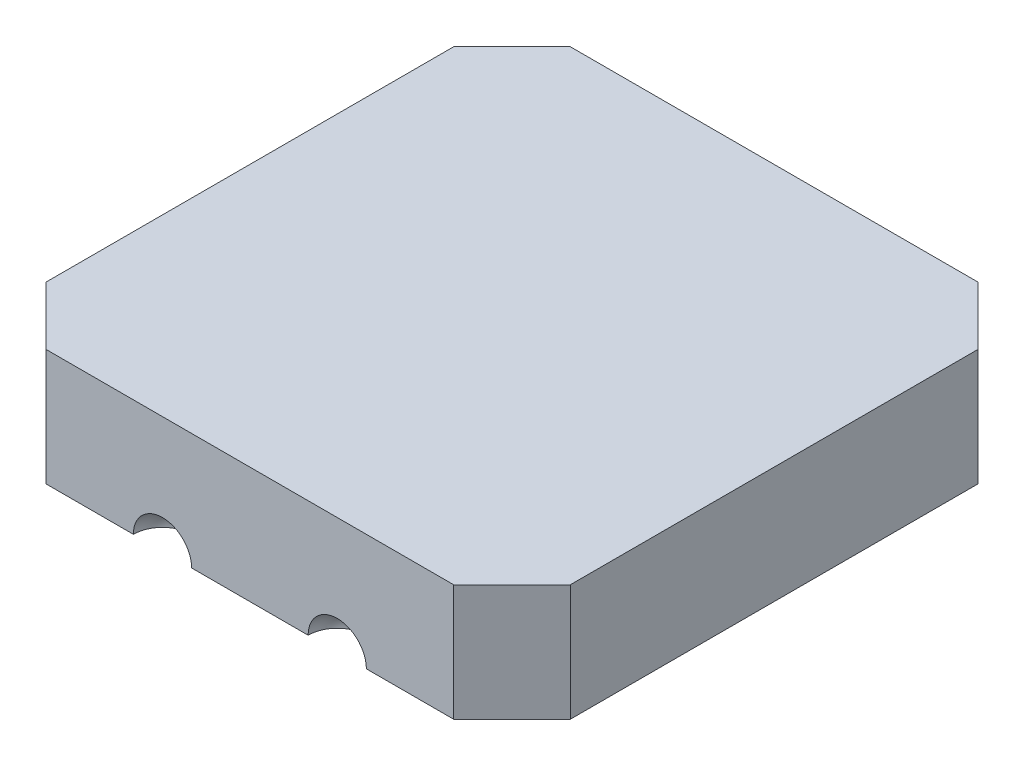
ISO-10303-21;
HEADER;
FILE_DESCRIPTION(('STEP AP214'),'2;1');
FILE_NAME('part.step','',(''),(''),'','','');
FILE_SCHEMA(('AUTOMOTIVE_DESIGN { 1 0 10303 214 1 1 1 1 }'));
ENDSEC;
DATA;
#1=APPLICATION_CONTEXT('core data for automotive mechanical design processes');
#2=APPLICATION_PROTOCOL_DEFINITION('international standard','automotive_design',2000,#1);
#3=PRODUCT_CONTEXT('',#1,'mechanical');
#4=PRODUCT('Part','Part','',(#3));
#5=PRODUCT_RELATED_PRODUCT_CATEGORY('part','',(#4));
#6=PRODUCT_DEFINITION_FORMATION('','',#4);
#7=PRODUCT_DEFINITION_CONTEXT('part definition',#1,'design');
#8=PRODUCT_DEFINITION('design','',#6,#7);
#9=PRODUCT_DEFINITION_SHAPE('','',#8);
#10=(LENGTH_UNIT() NAMED_UNIT(*) SI_UNIT(.MILLI.,.METRE.));
#11=(NAMED_UNIT(*) PLANE_ANGLE_UNIT() SI_UNIT($,.RADIAN.));
#12=(NAMED_UNIT(*) SI_UNIT($,.STERADIAN.) SOLID_ANGLE_UNIT());
#13=UNCERTAINTY_MEASURE_WITH_UNIT(LENGTH_MEASURE(1.E-05),#10,'distance_accuracy_value','');
#14=(GEOMETRIC_REPRESENTATION_CONTEXT(3) GLOBAL_UNCERTAINTY_ASSIGNED_CONTEXT((#13)) GLOBAL_UNIT_ASSIGNED_CONTEXT((#10,
#11,#12)) REPRESENTATION_CONTEXT('',''));
#15=CARTESIAN_POINT('',(0.,0.,0.));
#16=DIRECTION('',(0.,0.,1.));
#17=DIRECTION('',(1.,0.,0.));
#18=AXIS2_PLACEMENT_3D('',#15,#16,#17);
#19=CARTESIAN_POINT('',(57.15,25.4,57.15));
#20=DIRECTION('',(-1.,0.,0.));
#21=DIRECTION('',(0.,0.,1.));
#22=AXIS2_PLACEMENT_3D('',#19,#20,#21);
#23=PLANE('',#22);
#24=DIRECTION('',(0.,0.,-1.));
#25=VECTOR('',#24,1.);
#26=CARTESIAN_POINT('',(57.15,0.,57.15));
#27=LINE('',#26,#25);
#28=CARTESIAN_POINT('',(57.15,0.,44.45));
#29=VERTEX_POINT('',#28);
#30=CARTESIAN_POINT('',(57.15,0.,-44.4499999999999));
#31=VERTEX_POINT('',#30);
#32=EDGE_CURVE('E179',#29,#31,#27,.T.);
#33=ORIENTED_EDGE('',*,*,#32,.T.);
#34=DIRECTION('',(0.,1.,0.));
#35=VECTOR('',#34,1.);
#36=CARTESIAN_POINT('',(57.15,25.4,-44.4499999999999));
#37=LINE('',#36,#35);
#38=CARTESIAN_POINT('',(57.15,25.4,-44.4499999999999));
#39=VERTEX_POINT('',#38);
#40=EDGE_CURVE('E129',#31,#39,#37,.T.);
#41=ORIENTED_EDGE('',*,*,#40,.T.);
#42=DIRECTION('',(0.,0.,-1.));
#43=VECTOR('',#42,1.);
#44=CARTESIAN_POINT('',(57.15,25.4,57.15));
#45=LINE('',#44,#43);
#46=CARTESIAN_POINT('',(57.15,25.4,44.45));
#47=VERTEX_POINT('',#46);
#48=EDGE_CURVE('E153',#47,#39,#45,.T.);
#49=ORIENTED_EDGE('',*,*,#48,.F.);
#50=DIRECTION('',(0.,-1.,0.));
#51=VECTOR('',#50,1.);
#52=CARTESIAN_POINT('',(57.15,25.4,44.45));
#53=LINE('',#52,#51);
#54=EDGE_CURVE('E203',#47,#29,#53,.T.);
#55=ORIENTED_EDGE('',*,*,#54,.T.);
#56=EDGE_LOOP('',(#33,#41,#49,#55));
#57=FACE_BOUND('',#56,.T.);
#58=ADVANCED_FACE('F48',(#57),#23,.F.);
#59=CARTESIAN_POINT('',(-57.15,25.4,-57.15));
#60=DIRECTION('',(0.,0.,1.));
#61=DIRECTION('',(1.,0.,0.));
#62=AXIS2_PLACEMENT_3D('',#59,#60,#61);
#63=PLANE('',#62);
#64=DIRECTION('',(-1.,0.,0.));
#65=VECTOR('',#64,1.);
#66=CARTESIAN_POINT('',(-57.15,0.,-57.15));
#67=LINE('',#66,#65);
#68=CARTESIAN_POINT('',(44.45,0.,-57.15));
#69=VERTEX_POINT('',#68);
#70=CARTESIAN_POINT('',(-44.45,0.,-57.15));
#71=VERTEX_POINT('',#70);
#72=EDGE_CURVE('E148',#69,#71,#67,.T.);
#73=ORIENTED_EDGE('',*,*,#72,.T.);
#74=DIRECTION('',(0.,1.,0.));
#75=VECTOR('',#74,1.);
#76=CARTESIAN_POINT('',(-44.45,25.4,-57.15));
#77=LINE('',#76,#75);
#78=CARTESIAN_POINT('',(-44.45,25.4,-57.15));
#79=VERTEX_POINT('',#78);
#80=EDGE_CURVE('E192',#71,#79,#77,.T.);
#81=ORIENTED_EDGE('',*,*,#80,.T.);
#82=DIRECTION('',(-1.,0.,0.));
#83=VECTOR('',#82,1.);
#84=CARTESIAN_POINT('',(-57.15,25.4,-57.15));
#85=LINE('',#84,#83);
#86=CARTESIAN_POINT('',(44.45,25.4,-57.15));
#87=VERTEX_POINT('',#86);
#88=EDGE_CURVE('E158',#87,#79,#85,.T.);
#89=ORIENTED_EDGE('',*,*,#88,.F.);
#90=DIRECTION('',(0.,-1.,0.));
#91=VECTOR('',#90,1.);
#92=CARTESIAN_POINT('',(44.45,25.4,-57.15));
#93=LINE('',#92,#91);
#94=EDGE_CURVE('E194',#87,#69,#93,.T.);
#95=ORIENTED_EDGE('',*,*,#94,.T.);
#96=EDGE_LOOP('',(#73,#81,#89,#95));
#97=FACE_BOUND('',#96,.T.);
#98=ADVANCED_FACE('F190',(#97),#63,.F.);
#99=CARTESIAN_POINT('',(-57.15,25.4,57.15));
#100=DIRECTION('',(1.,0.,0.));
#101=DIRECTION('',(0.,0.,-1.));
#102=AXIS2_PLACEMENT_3D('',#99,#100,#101);
#103=PLANE('',#102);
#104=DIRECTION('',(0.,0.,1.));
#105=VECTOR('',#104,1.);
#106=CARTESIAN_POINT('',(-57.15,0.,57.15));
#107=LINE('',#106,#105);
#108=CARTESIAN_POINT('',(-57.15,0.,-44.45));
#109=VERTEX_POINT('',#108);
#110=CARTESIAN_POINT('',(-57.15,0.,44.4499999999999));
#111=VERTEX_POINT('',#110);
#112=EDGE_CURVE('E142',#109,#111,#107,.T.);
#113=ORIENTED_EDGE('',*,*,#112,.T.);
#114=DIRECTION('',(0.,1.,0.));
#115=VECTOR('',#114,1.);
#116=CARTESIAN_POINT('',(-57.15,25.4,44.4499999999999));
#117=LINE('',#116,#115);
#118=CARTESIAN_POINT('',(-57.15,25.4,44.4499999999999));
#119=VERTEX_POINT('',#118);
#120=EDGE_CURVE('E227',#111,#119,#117,.T.);
#121=ORIENTED_EDGE('',*,*,#120,.T.);
#122=DIRECTION('',(0.,0.,1.));
#123=VECTOR('',#122,1.);
#124=CARTESIAN_POINT('',(-57.15,25.4,57.15));
#125=LINE('',#124,#123);
#126=CARTESIAN_POINT('',(-57.15,25.4,-44.45));
#127=VERTEX_POINT('',#126);
#128=EDGE_CURVE('E165',#127,#119,#125,.T.);
#129=ORIENTED_EDGE('',*,*,#128,.F.);
#130=DIRECTION('',(0.,-1.,0.));
#131=VECTOR('',#130,1.);
#132=CARTESIAN_POINT('',(-57.15,25.4,-44.45));
#133=LINE('',#132,#131);
#134=EDGE_CURVE('E254',#127,#109,#133,.T.);
#135=ORIENTED_EDGE('',*,*,#134,.T.);
#136=EDGE_LOOP('',(#113,#121,#129,#135));
#137=FACE_BOUND('',#136,.T.);
#138=ADVANCED_FACE('F258',(#137),#103,.F.);
#139=CARTESIAN_POINT('',(-57.15,25.4,57.15));
#140=DIRECTION('',(0.,0.,-1.));
#141=DIRECTION('',(-1.,0.,0.));
#142=AXIS2_PLACEMENT_3D('',#139,#140,#141);
#143=PLANE('',#142);
#144=CARTESIAN_POINT('',(-19.05,0.,57.15));
#145=DIRECTION('',(0.,0.,-1.));
#146=DIRECTION('',(-1.,0.,0.));
#147=AXIS2_PLACEMENT_3D('',#144,#145,#146);
#148=CIRCLE('',#147,6.35);
#149=CARTESIAN_POINT('',(-12.7,0.,57.15));
#150=VERTEX_POINT('',#149);
#151=CARTESIAN_POINT('',(-25.4,0.,57.15));
#152=VERTEX_POINT('',#151);
#153=EDGE_CURVE('E71',#150,#152,#148,.F.);
#154=ORIENTED_EDGE('',*,*,#153,.F.);
#155=DIRECTION('',(1.,0.,0.));
#156=VECTOR('',#155,1.);
#157=CARTESIAN_POINT('',(-57.15,0.,57.15));
#158=LINE('',#157,#156);
#159=CARTESIAN_POINT('',(12.7,0.,57.15));
#160=VERTEX_POINT('',#159);
#161=EDGE_CURVE('E134',#150,#160,#158,.T.);
#162=ORIENTED_EDGE('',*,*,#161,.T.);
#163=CARTESIAN_POINT('',(19.05,0.,57.15));
#164=DIRECTION('',(0.,0.,-1.));
#165=DIRECTION('',(-1.,0.,0.));
#166=AXIS2_PLACEMENT_3D('',#163,#164,#165);
#167=CIRCLE('',#166,6.35);
#168=CARTESIAN_POINT('',(25.4,0.,57.15));
#169=VERTEX_POINT('',#168);
#170=EDGE_CURVE('E64',#169,#160,#167,.F.);
#171=ORIENTED_EDGE('',*,*,#170,.F.);
#172=CARTESIAN_POINT('',(44.45,0.,57.15));
#173=VERTEX_POINT('',#172);
#174=EDGE_CURVE('E132',#169,#173,#158,.T.);
#175=ORIENTED_EDGE('',*,*,#174,.T.);
#176=DIRECTION('',(0.,1.,0.));
#177=VECTOR('',#176,1.);
#178=CARTESIAN_POINT('',(44.45,25.4,57.15));
#179=LINE('',#178,#177);
#180=CARTESIAN_POINT('',(44.45,25.4,57.15));
#181=VERTEX_POINT('',#180);
#182=EDGE_CURVE('E178',#173,#181,#179,.T.);
#183=ORIENTED_EDGE('',*,*,#182,.T.);
#184=DIRECTION('',(1.,0.,0.));
#185=VECTOR('',#184,1.);
#186=CARTESIAN_POINT('',(-57.15,25.4,57.15));
#187=LINE('',#186,#185);
#188=CARTESIAN_POINT('',(-44.45,25.4,57.15));
#189=VERTEX_POINT('',#188);
#190=EDGE_CURVE('E174',#189,#181,#187,.T.);
#191=ORIENTED_EDGE('',*,*,#190,.F.);
#192=DIRECTION('',(0.,-1.,0.));
#193=VECTOR('',#192,1.);
#194=CARTESIAN_POINT('',(-44.45,25.4,57.15));
#195=LINE('',#194,#193);
#196=CARTESIAN_POINT('',(-44.45,0.,57.15));
#197=VERTEX_POINT('',#196);
#198=EDGE_CURVE('E239',#189,#197,#195,.T.);
#199=ORIENTED_EDGE('',*,*,#198,.T.);
#200=EDGE_CURVE('E144',#197,#152,#158,.T.);
#201=ORIENTED_EDGE('',*,*,#200,.T.);
#202=EDGE_LOOP('',(#154,#162,#171,#175,#183,#191,#199,#201));
#203=FACE_BOUND('',#202,.T.);
#204=ADVANCED_FACE('F131',(#203),#143,.F.);
#205=CARTESIAN_POINT('',(0.,25.4,0.));
#206=DIRECTION('',(0.,-1.,0.));
#207=DIRECTION('',(0.,0.,-1.));
#208=AXIS2_PLACEMENT_3D('',#205,#206,#207);
#209=PLANE('',#208);
#210=ORIENTED_EDGE('',*,*,#128,.T.);
#211=DIRECTION('',(-0.707106781186547,0.,-0.707106781186548));
#212=VECTOR('',#211,1.);
#213=CARTESIAN_POINT('',(-44.45,25.4,57.15));
#214=LINE('',#213,#212);
#215=EDGE_CURVE('E209',#119,#189,#214,.F.);
#216=ORIENTED_EDGE('',*,*,#215,.T.);
#217=ORIENTED_EDGE('',*,*,#190,.T.);
#218=DIRECTION('',(-0.707106781186548,0.,0.707106781186547));
#219=VECTOR('',#218,1.);
#220=CARTESIAN_POINT('',(57.15,25.4,44.45));
#221=LINE('',#220,#219);
#222=EDGE_CURVE('E222',#181,#47,#221,.F.);
#223=ORIENTED_EDGE('',*,*,#222,.T.);
#224=ORIENTED_EDGE('',*,*,#48,.T.);
#225=DIRECTION('',(0.707106781186547,0.,0.707106781186548));
#226=VECTOR('',#225,1.);
#227=CARTESIAN_POINT('',(44.45,25.4,-57.15));
#228=LINE('',#227,#226);
#229=EDGE_CURVE('E220',#39,#87,#228,.F.);
#230=ORIENTED_EDGE('',*,*,#229,.T.);
#231=ORIENTED_EDGE('',*,*,#88,.T.);
#232=DIRECTION('',(0.707106781186548,0.,-0.707106781186547));
#233=VECTOR('',#232,1.);
#234=CARTESIAN_POINT('',(-57.15,25.4,-44.45));
#235=LINE('',#234,#233);
#236=EDGE_CURVE('E201',#79,#127,#235,.F.);
#237=ORIENTED_EDGE('',*,*,#236,.T.);
#238=EDGE_LOOP('',(#210,#216,#217,#223,#224,#230,#231,#237));
#239=FACE_BOUND('',#238,.T.);
#240=ADVANCED_FACE('F233',(#239),#209,.F.);
#241=CARTESIAN_POINT('',(0.,0.,0.));
#242=DIRECTION('',(0.,-1.,0.));
#243=DIRECTION('',(0.,0.,-1.));
#244=AXIS2_PLACEMENT_3D('',#241,#242,#243);
#245=PLANE('',#244);
#246=CARTESIAN_POINT('',(0.,0.,47.625));
#247=DIRECTION('',(0.,-1.,0.));
#248=DIRECTION('',(0.,0.,-1.));
#249=AXIS2_PLACEMENT_3D('',#246,#247,#248);
#250=CIRCLE('',#249,6.35);
#251=CARTESIAN_POINT('',(0.,0.,41.275));
#252=VERTEX_POINT('',#251);
#253=EDGE_CURVE('E168',#252,#252,#250,.T.);
#254=ORIENTED_EDGE('',*,*,#253,.F.);
#255=EDGE_LOOP('',(#254));
#256=FACE_BOUND('',#255,.T.);
#257=ORIENTED_EDGE('',*,*,#161,.F.);
#258=CARTESIAN_POINT('',(-19.05,0.,57.15));
#259=DIRECTION('',(0.,-1.,0.));
#260=DIRECTION('',(0.,0.,-1.));
#261=AXIS2_PLACEMENT_3D('',#258,#259,#260);
#262=CIRCLE('',#261,6.35);
#263=EDGE_CURVE('E11',#150,#152,#262,.F.);
#264=ORIENTED_EDGE('',*,*,#263,.T.);
#265=ORIENTED_EDGE('',*,*,#200,.F.);
#266=DIRECTION('',(0.707106781186547,0.,0.707106781186548));
#267=VECTOR('',#266,1.);
#268=CARTESIAN_POINT('',(-50.8,0.,50.7999999999999));
#269=LINE('',#268,#267);
#270=EDGE_CURVE('E241',#197,#111,#269,.F.);
#271=ORIENTED_EDGE('',*,*,#270,.T.);
#272=ORIENTED_EDGE('',*,*,#112,.F.);
#273=DIRECTION('',(-0.707106781186548,0.,0.707106781186547));
#274=VECTOR('',#273,1.);
#275=CARTESIAN_POINT('',(-50.7999999999999,0.,-50.8));
#276=LINE('',#275,#274);
#277=EDGE_CURVE('E199',#109,#71,#276,.F.);
#278=ORIENTED_EDGE('',*,*,#277,.T.);
#279=ORIENTED_EDGE('',*,*,#72,.F.);
#280=DIRECTION('',(-0.707106781186547,0.,-0.707106781186548));
#281=VECTOR('',#280,1.);
#282=CARTESIAN_POINT('',(50.8,0.,-50.7999999999999));
#283=LINE('',#282,#281);
#284=EDGE_CURVE('E219',#69,#31,#283,.F.);
#285=ORIENTED_EDGE('',*,*,#284,.T.);
#286=ORIENTED_EDGE('',*,*,#32,.F.);
#287=DIRECTION('',(0.707106781186548,0.,-0.707106781186547));
#288=VECTOR('',#287,1.);
#289=CARTESIAN_POINT('',(50.7999999999999,0.,50.8));
#290=LINE('',#289,#288);
#291=EDGE_CURVE('E139',#29,#173,#290,.F.);
#292=ORIENTED_EDGE('',*,*,#291,.T.);
#293=ORIENTED_EDGE('',*,*,#174,.F.);
#294=CARTESIAN_POINT('',(19.05,0.,57.15));
#295=DIRECTION('',(0.,-1.,0.));
#296=DIRECTION('',(0.,0.,-1.));
#297=AXIS2_PLACEMENT_3D('',#294,#295,#296);
#298=CIRCLE('',#297,6.35);
#299=EDGE_CURVE('E58',#169,#160,#298,.F.);
#300=ORIENTED_EDGE('',*,*,#299,.T.);
#301=EDGE_LOOP('',(#257,#264,#265,#271,#272,#278,#279,#285,#286,#292,#293,#300));
#302=FACE_BOUND('',#301,.T.);
#303=ADVANCED_FACE('F137',(#256,#302),#245,.T.);
#304=CARTESIAN_POINT('',(-44.45,25.4,57.15));
#305=DIRECTION('',(0.707106781186548,0.,-0.707106781186547));
#306=DIRECTION('',(0.,-1.,0.));
#307=AXIS2_PLACEMENT_3D('',#304,#305,#306);
#308=PLANE('',#307);
#309=ORIENTED_EDGE('',*,*,#215,.F.);
#310=ORIENTED_EDGE('',*,*,#120,.F.);
#311=ORIENTED_EDGE('',*,*,#270,.F.);
#312=ORIENTED_EDGE('',*,*,#198,.F.);
#313=EDGE_LOOP('',(#309,#310,#311,#312));
#314=FACE_BOUND('',#313,.T.);
#315=ADVANCED_FACE('F240',(#314),#308,.F.);
#316=CARTESIAN_POINT('',(-57.15,25.4,-44.45));
#317=DIRECTION('',(0.707106781186547,0.,0.707106781186548));
#318=DIRECTION('',(0.,-1.,0.));
#319=AXIS2_PLACEMENT_3D('',#316,#317,#318);
#320=PLANE('',#319);
#321=ORIENTED_EDGE('',*,*,#236,.F.);
#322=ORIENTED_EDGE('',*,*,#80,.F.);
#323=ORIENTED_EDGE('',*,*,#277,.F.);
#324=ORIENTED_EDGE('',*,*,#134,.F.);
#325=EDGE_LOOP('',(#321,#322,#323,#324));
#326=FACE_BOUND('',#325,.T.);
#327=ADVANCED_FACE('F197',(#326),#320,.F.);
#328=CARTESIAN_POINT('',(44.45,25.4,-57.15));
#329=DIRECTION('',(-0.707106781186548,0.,0.707106781186547));
#330=DIRECTION('',(0.,-1.,0.));
#331=AXIS2_PLACEMENT_3D('',#328,#329,#330);
#332=PLANE('',#331);
#333=ORIENTED_EDGE('',*,*,#229,.F.);
#334=ORIENTED_EDGE('',*,*,#40,.F.);
#335=ORIENTED_EDGE('',*,*,#284,.F.);
#336=ORIENTED_EDGE('',*,*,#94,.F.);
#337=EDGE_LOOP('',(#333,#334,#335,#336));
#338=FACE_BOUND('',#337,.T.);
#339=ADVANCED_FACE('F218',(#338),#332,.F.);
#340=CARTESIAN_POINT('',(57.15,25.4,44.45));
#341=DIRECTION('',(-0.707106781186547,0.,-0.707106781186548));
#342=DIRECTION('',(0.,-1.,0.));
#343=AXIS2_PLACEMENT_3D('',#340,#341,#342);
#344=PLANE('',#343);
#345=ORIENTED_EDGE('',*,*,#222,.F.);
#346=ORIENTED_EDGE('',*,*,#182,.F.);
#347=ORIENTED_EDGE('',*,*,#291,.F.);
#348=ORIENTED_EDGE('',*,*,#54,.F.);
#349=EDGE_LOOP('',(#345,#346,#347,#348));
#350=FACE_BOUND('',#349,.T.);
#351=ADVANCED_FACE('F51',(#350),#344,.F.);
#352=CARTESIAN_POINT('',(0.,5.08,47.625));
#353=DIRECTION('',(0.,-1.,0.));
#354=DIRECTION('',(0.,0.,-1.));
#355=AXIS2_PLACEMENT_3D('',#352,#353,#354);
#356=CYLINDRICAL_SURFACE('',#355,6.35);
#357=CARTESIAN_POINT('',(0.,5.08,47.625));
#358=DIRECTION('',(0.,-1.,0.));
#359=DIRECTION('',(0.,0.,-1.));
#360=AXIS2_PLACEMENT_3D('',#357,#358,#359);
#361=CIRCLE('',#360,6.35);
#362=CARTESIAN_POINT('',(0.,5.08,41.275));
#363=VERTEX_POINT('',#362);
#364=EDGE_CURVE('E183',#363,#363,#361,.T.);
#365=ORIENTED_EDGE('',*,*,#364,.F.);
#366=EDGE_LOOP('',(#365));
#367=FACE_BOUND('',#366,.T.);
#368=ORIENTED_EDGE('',*,*,#253,.T.);
#369=EDGE_LOOP('',(#368));
#370=FACE_BOUND('',#369,.T.);
#371=ADVANCED_FACE('F271',(#367,#370),#356,.F.);
#372=CARTESIAN_POINT('',(0.,5.08,0.));
#373=DIRECTION('',(0.,-1.,0.));
#374=DIRECTION('',(0.,0.,-1.));
#375=AXIS2_PLACEMENT_3D('',#372,#373,#374);
#376=PLANE('',#375);
#377=ORIENTED_EDGE('',*,*,#364,.T.);
#378=EDGE_LOOP('',(#377));
#379=FACE_BOUND('',#378,.T.);
#380=ADVANCED_FACE('F269',(#379),#376,.T.);
#381=CARTESIAN_POINT('',(19.05,0.,57.15));
#382=DIRECTION('',(-1.,0.,0.));
#383=DIRECTION('',(0.,1.,0.));
#384=AXIS2_PLACEMENT_3D('',#381,#382,#383);
#385=SPHERICAL_SURFACE('',#384,6.35);
#386=ORIENTED_EDGE('',*,*,#170,.T.);
#387=ORIENTED_EDGE('',*,*,#299,.F.);
#388=EDGE_LOOP('',(#386,#387));
#389=FACE_BOUND('',#388,.T.);
#390=ADVANCED_FACE('F123',(#389),#385,.F.);
#391=CARTESIAN_POINT('',(-19.05,0.,57.15));
#392=DIRECTION('',(-1.,0.,0.));
#393=DIRECTION('',(0.,1.,0.));
#394=AXIS2_PLACEMENT_3D('',#391,#392,#393);
#395=SPHERICAL_SURFACE('',#394,6.35);
#396=ORIENTED_EDGE('',*,*,#153,.T.);
#397=ORIENTED_EDGE('',*,*,#263,.F.);
#398=EDGE_LOOP('',(#396,#397));
#399=FACE_BOUND('',#398,.T.);
#400=ADVANCED_FACE('F260',(#399),#395,.F.);
#401=CLOSED_SHELL('',(#58,#98,#138,#204,#240,#303,#315,#327,#339,#351,#371,#380,#390,#400));
#402=MANIFOLD_SOLID_BREP('B2',#401);
#403=ADVANCED_BREP_SHAPE_REPRESENTATION('',(#18,#402),#14);
#404=SHAPE_DEFINITION_REPRESENTATION(#9,#403);
ENDSEC;
END-ISO-10303-21;
